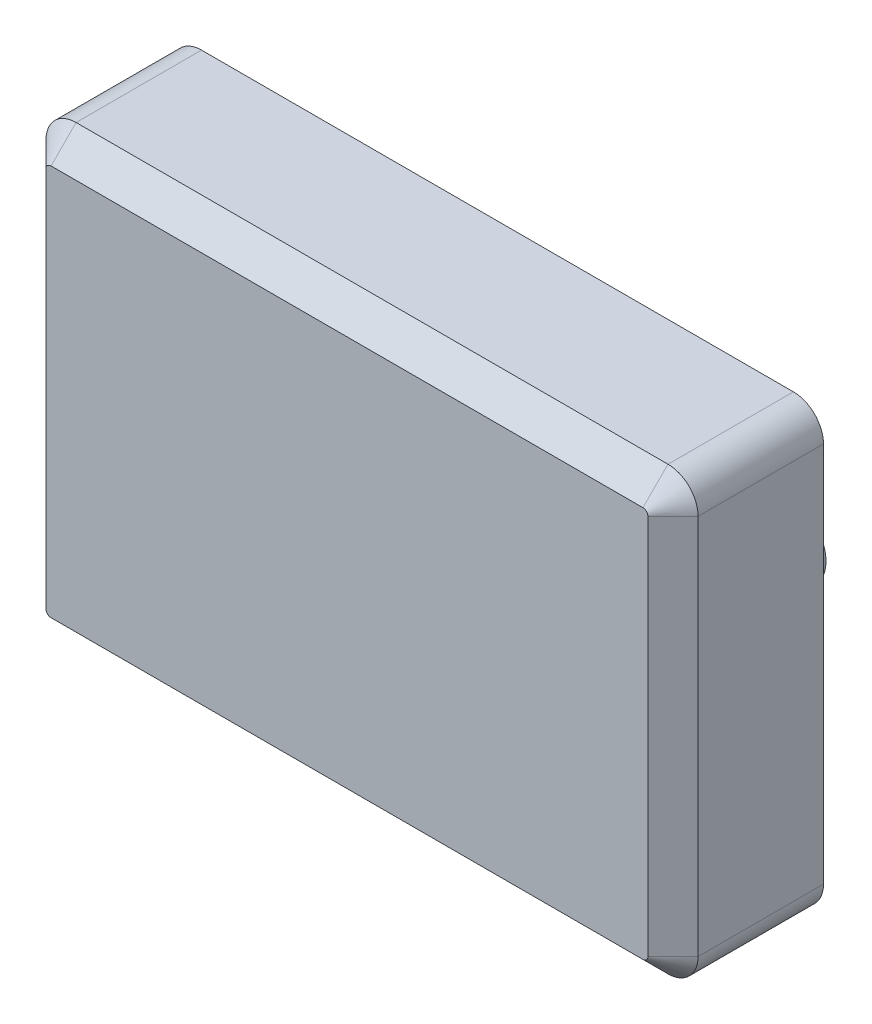
ISO-10303-21;
HEADER;
FILE_DESCRIPTION(('STEP AP214'),'2;1');
FILE_NAME('part.step','',(''),(''),'','','');
FILE_SCHEMA(('AUTOMOTIVE_DESIGN { 1 0 10303 214 1 1 1 1 }'));
ENDSEC;
DATA;
#1=APPLICATION_CONTEXT('core data for automotive mechanical design processes');
#2=APPLICATION_PROTOCOL_DEFINITION('international standard','automotive_design',2000,#1);
#3=PRODUCT_CONTEXT('',#1,'mechanical');
#4=PRODUCT('Part','Part','',(#3));
#5=PRODUCT_RELATED_PRODUCT_CATEGORY('part','',(#4));
#6=PRODUCT_DEFINITION_FORMATION('','',#4);
#7=PRODUCT_DEFINITION_CONTEXT('part definition',#1,'design');
#8=PRODUCT_DEFINITION('design','',#6,#7);
#9=PRODUCT_DEFINITION_SHAPE('','',#8);
#10=(LENGTH_UNIT() NAMED_UNIT(*) SI_UNIT(.MILLI.,.METRE.));
#11=(NAMED_UNIT(*) PLANE_ANGLE_UNIT() SI_UNIT($,.RADIAN.));
#12=(NAMED_UNIT(*) SI_UNIT($,.STERADIAN.) SOLID_ANGLE_UNIT());
#13=UNCERTAINTY_MEASURE_WITH_UNIT(LENGTH_MEASURE(1.E-05),#10,'distance_accuracy_value','');
#14=(GEOMETRIC_REPRESENTATION_CONTEXT(3) GLOBAL_UNCERTAINTY_ASSIGNED_CONTEXT((#13)) GLOBAL_UNIT_ASSIGNED_CONTEXT((#10,
#11,#12)) REPRESENTATION_CONTEXT('',''));
#15=CARTESIAN_POINT('',(0.,0.,0.));
#16=DIRECTION('',(0.,0.,1.));
#17=DIRECTION('',(1.,0.,0.));
#18=AXIS2_PLACEMENT_3D('',#15,#16,#17);
#19=CARTESIAN_POINT('',(-5.9,-3.8,3.));
#20=DIRECTION('',(0.,0.,-1.));
#21=DIRECTION('',(-1.,0.,0.));
#22=AXIS2_PLACEMENT_3D('',#19,#20,#21);
#23=CYLINDRICAL_SURFACE('',#22,0.6);
#24=DIRECTION('',(0.,0.,-1.));
#25=VECTOR('',#24,1.);
#26=CARTESIAN_POINT('',(-5.9,-4.4,3.));
#27=LINE('',#26,#25);
#28=CARTESIAN_POINT('',(-5.9,-4.4,2.5));
#29=VERTEX_POINT('',#28);
#30=CARTESIAN_POINT('',(-5.9,-4.4,0.));
#31=VERTEX_POINT('',#30);
#32=EDGE_CURVE('E130',#29,#31,#27,.T.);
#33=ORIENTED_EDGE('',*,*,#32,.F.);
#34=CARTESIAN_POINT('',(-5.9,-3.8,2.5));
#35=DIRECTION('',(0.,0.,1.));
#36=DIRECTION('',(1.,0.,0.));
#37=AXIS2_PLACEMENT_3D('',#34,#35,#36);
#38=CIRCLE('',#37,0.6);
#39=CARTESIAN_POINT('',(-6.5,-3.8,2.5));
#40=VERTEX_POINT('',#39);
#41=EDGE_CURVE('E216',#29,#40,#38,.F.);
#42=ORIENTED_EDGE('',*,*,#41,.T.);
#43=DIRECTION('',(0.,0.,-1.));
#44=VECTOR('',#43,1.);
#45=CARTESIAN_POINT('',(-6.5,-3.8,3.));
#46=LINE('',#45,#44);
#47=CARTESIAN_POINT('',(-6.5,-3.8,0.));
#48=VERTEX_POINT('',#47);
#49=EDGE_CURVE('E151',#40,#48,#46,.T.);
#50=ORIENTED_EDGE('',*,*,#49,.T.);
#51=CARTESIAN_POINT('',(-5.9,-3.8,0.));
#52=DIRECTION('',(0.,0.,1.));
#53=DIRECTION('',(1.,0.,0.));
#54=AXIS2_PLACEMENT_3D('',#51,#52,#53);
#55=CIRCLE('',#54,0.6);
#56=EDGE_CURVE('E145',#48,#31,#55,.T.);
#57=ORIENTED_EDGE('',*,*,#56,.T.);
#58=EDGE_LOOP('',(#33,#42,#50,#57));
#59=FACE_BOUND('',#58,.T.);
#60=ADVANCED_FACE('F42',(#59),#23,.T.);
#61=CARTESIAN_POINT('',(-5.9,-4.4,3.));
#62=DIRECTION('',(0.,1.,0.));
#63=DIRECTION('',(0.,0.,1.));
#64=AXIS2_PLACEMENT_3D('',#61,#62,#63);
#65=PLANE('',#64);
#66=DIRECTION('',(0.,0.,-1.));
#67=VECTOR('',#66,1.);
#68=CARTESIAN_POINT('',(5.9,-4.4,3.));
#69=LINE('',#68,#67);
#70=CARTESIAN_POINT('',(5.9,-4.4,2.5));
#71=VERTEX_POINT('',#70);
#72=CARTESIAN_POINT('',(5.9,-4.4,0.));
#73=VERTEX_POINT('',#72);
#74=EDGE_CURVE('E139',#71,#73,#69,.T.);
#75=ORIENTED_EDGE('',*,*,#74,.F.);
#76=DIRECTION('',(-1.,0.,0.));
#77=VECTOR('',#76,1.);
#78=CARTESIAN_POINT('',(-5.9,-4.4,2.5));
#79=LINE('',#78,#77);
#80=EDGE_CURVE('E11',#71,#29,#79,.T.);
#81=ORIENTED_EDGE('',*,*,#80,.T.);
#82=ORIENTED_EDGE('',*,*,#32,.T.);
#83=DIRECTION('',(1.,0.,0.));
#84=VECTOR('',#83,1.);
#85=CARTESIAN_POINT('',(-5.9,-4.4,0.));
#86=LINE('',#85,#84);
#87=EDGE_CURVE('E133',#31,#73,#86,.T.);
#88=ORIENTED_EDGE('',*,*,#87,.T.);
#89=EDGE_LOOP('',(#75,#81,#82,#88));
#90=FACE_BOUND('',#89,.T.);
#91=ADVANCED_FACE('F132',(#90),#65,.F.);
#92=CARTESIAN_POINT('',(5.9,-3.8,3.));
#93=DIRECTION('',(0.,0.,-1.));
#94=DIRECTION('',(-1.,0.,0.));
#95=AXIS2_PLACEMENT_3D('',#92,#93,#94);
#96=CYLINDRICAL_SURFACE('',#95,0.6);
#97=DIRECTION('',(0.,0.,-1.));
#98=VECTOR('',#97,1.);
#99=CARTESIAN_POINT('',(6.5,-3.8,3.));
#100=LINE('',#99,#98);
#101=CARTESIAN_POINT('',(6.5,-3.8,2.5));
#102=VERTEX_POINT('',#101);
#103=CARTESIAN_POINT('',(6.5,-3.8,0.));
#104=VERTEX_POINT('',#103);
#105=EDGE_CURVE('E186',#102,#104,#100,.T.);
#106=ORIENTED_EDGE('',*,*,#105,.F.);
#107=CARTESIAN_POINT('',(5.9,-3.8,2.5));
#108=DIRECTION('',(0.,0.,1.));
#109=DIRECTION('',(1.,0.,0.));
#110=AXIS2_PLACEMENT_3D('',#107,#108,#109);
#111=CIRCLE('',#110,0.6);
#112=EDGE_CURVE('E52',#102,#71,#111,.F.);
#113=ORIENTED_EDGE('',*,*,#112,.T.);
#114=ORIENTED_EDGE('',*,*,#74,.T.);
#115=CARTESIAN_POINT('',(5.9,-3.8,0.));
#116=DIRECTION('',(0.,0.,1.));
#117=DIRECTION('',(1.,0.,0.));
#118=AXIS2_PLACEMENT_3D('',#115,#116,#117);
#119=CIRCLE('',#118,0.6);
#120=EDGE_CURVE('E148',#73,#104,#119,.T.);
#121=ORIENTED_EDGE('',*,*,#120,.T.);
#122=EDGE_LOOP('',(#106,#113,#114,#121));
#123=FACE_BOUND('',#122,.T.);
#124=ADVANCED_FACE('F276',(#123),#96,.T.);
#125=CARTESIAN_POINT('',(6.5,-3.8,3.));
#126=DIRECTION('',(-1.,0.,0.));
#127=DIRECTION('',(0.,0.,1.));
#128=AXIS2_PLACEMENT_3D('',#125,#126,#127);
#129=PLANE('',#128);
#130=DIRECTION('',(0.,0.,-1.));
#131=VECTOR('',#130,1.);
#132=CARTESIAN_POINT('',(6.5,3.8,3.));
#133=LINE('',#132,#131);
#134=CARTESIAN_POINT('',(6.5,3.8,2.5));
#135=VERTEX_POINT('',#134);
#136=CARTESIAN_POINT('',(6.5,3.8,0.));
#137=VERTEX_POINT('',#136);
#138=EDGE_CURVE('E184',#135,#137,#133,.T.);
#139=ORIENTED_EDGE('',*,*,#138,.F.);
#140=DIRECTION('',(0.,-1.,0.));
#141=VECTOR('',#140,1.);
#142=CARTESIAN_POINT('',(6.5,-3.8,2.5));
#143=LINE('',#142,#141);
#144=EDGE_CURVE('E214',#135,#102,#143,.T.);
#145=ORIENTED_EDGE('',*,*,#144,.T.);
#146=ORIENTED_EDGE('',*,*,#105,.T.);
#147=DIRECTION('',(0.,1.,0.));
#148=VECTOR('',#147,1.);
#149=CARTESIAN_POINT('',(6.5,-3.8,0.));
#150=LINE('',#149,#148);
#151=EDGE_CURVE('E163',#104,#137,#150,.T.);
#152=ORIENTED_EDGE('',*,*,#151,.T.);
#153=EDGE_LOOP('',(#139,#145,#146,#152));
#154=FACE_BOUND('',#153,.T.);
#155=ADVANCED_FACE('F354',(#154),#129,.F.);
#156=CARTESIAN_POINT('',(5.9,3.8,3.));
#157=DIRECTION('',(0.,0.,-1.));
#158=DIRECTION('',(-1.,0.,0.));
#159=AXIS2_PLACEMENT_3D('',#156,#157,#158);
#160=CYLINDRICAL_SURFACE('',#159,0.6);
#161=DIRECTION('',(0.,0.,-1.));
#162=VECTOR('',#161,1.);
#163=CARTESIAN_POINT('',(5.9,4.4,3.));
#164=LINE('',#163,#162);
#165=CARTESIAN_POINT('',(5.9,4.4,2.5));
#166=VERTEX_POINT('',#165);
#167=CARTESIAN_POINT('',(5.9,4.4,0.));
#168=VERTEX_POINT('',#167);
#169=EDGE_CURVE('E182',#166,#168,#164,.T.);
#170=ORIENTED_EDGE('',*,*,#169,.F.);
#171=CARTESIAN_POINT('',(5.9,3.8,2.5));
#172=DIRECTION('',(0.,0.,1.));
#173=DIRECTION('',(1.,0.,0.));
#174=AXIS2_PLACEMENT_3D('',#171,#172,#173);
#175=CIRCLE('',#174,0.6);
#176=EDGE_CURVE('E210',#166,#135,#175,.F.);
#177=ORIENTED_EDGE('',*,*,#176,.T.);
#178=ORIENTED_EDGE('',*,*,#138,.T.);
#179=CARTESIAN_POINT('',(5.9,3.8,0.));
#180=DIRECTION('',(0.,0.,1.));
#181=DIRECTION('',(1.,0.,0.));
#182=AXIS2_PLACEMENT_3D('',#179,#180,#181);
#183=CIRCLE('',#182,0.6);
#184=EDGE_CURVE('E166',#137,#168,#183,.T.);
#185=ORIENTED_EDGE('',*,*,#184,.T.);
#186=EDGE_LOOP('',(#170,#177,#178,#185));
#187=FACE_BOUND('',#186,.T.);
#188=ADVANCED_FACE('F351',(#187),#160,.T.);
#189=CARTESIAN_POINT('',(5.9,4.4,3.));
#190=DIRECTION('',(0.,-1.,0.));
#191=DIRECTION('',(0.,0.,-1.));
#192=AXIS2_PLACEMENT_3D('',#189,#190,#191);
#193=PLANE('',#192);
#194=DIRECTION('',(0.,0.,-1.));
#195=VECTOR('',#194,1.);
#196=CARTESIAN_POINT('',(-5.9,4.4,3.));
#197=LINE('',#196,#195);
#198=CARTESIAN_POINT('',(-5.9,4.4,2.5));
#199=VERTEX_POINT('',#198);
#200=CARTESIAN_POINT('',(-5.9,4.4,0.));
#201=VERTEX_POINT('',#200);
#202=EDGE_CURVE('E180',#199,#201,#197,.T.);
#203=ORIENTED_EDGE('',*,*,#202,.F.);
#204=DIRECTION('',(1.,0.,0.));
#205=VECTOR('',#204,1.);
#206=CARTESIAN_POINT('',(5.9,4.4,2.5));
#207=LINE('',#206,#205);
#208=EDGE_CURVE('E205',#199,#166,#207,.T.);
#209=ORIENTED_EDGE('',*,*,#208,.T.);
#210=ORIENTED_EDGE('',*,*,#169,.T.);
#211=DIRECTION('',(-1.,0.,0.));
#212=VECTOR('',#211,1.);
#213=CARTESIAN_POINT('',(5.9,4.4,0.));
#214=LINE('',#213,#212);
#215=EDGE_CURVE('E169',#168,#201,#214,.T.);
#216=ORIENTED_EDGE('',*,*,#215,.T.);
#217=EDGE_LOOP('',(#203,#209,#210,#216));
#218=FACE_BOUND('',#217,.T.);
#219=ADVANCED_FACE('F348',(#218),#193,.F.);
#220=CARTESIAN_POINT('',(-5.9,3.8,3.));
#221=DIRECTION('',(0.,0.,-1.));
#222=DIRECTION('',(-1.,0.,0.));
#223=AXIS2_PLACEMENT_3D('',#220,#221,#222);
#224=CYLINDRICAL_SURFACE('',#223,0.6);
#225=DIRECTION('',(0.,0.,-1.));
#226=VECTOR('',#225,1.);
#227=CARTESIAN_POINT('',(-6.5,3.8,3.));
#228=LINE('',#227,#226);
#229=CARTESIAN_POINT('',(-6.5,3.8,2.5));
#230=VERTEX_POINT('',#229);
#231=CARTESIAN_POINT('',(-6.5,3.8,0.));
#232=VERTEX_POINT('',#231);
#233=EDGE_CURVE('E178',#230,#232,#228,.T.);
#234=ORIENTED_EDGE('',*,*,#233,.F.);
#235=CARTESIAN_POINT('',(-5.9,3.8,2.5));
#236=DIRECTION('',(0.,0.,1.));
#237=DIRECTION('',(1.,0.,0.));
#238=AXIS2_PLACEMENT_3D('',#235,#236,#237);
#239=CIRCLE('',#238,0.6);
#240=EDGE_CURVE('E208',#230,#199,#239,.F.);
#241=ORIENTED_EDGE('',*,*,#240,.T.);
#242=ORIENTED_EDGE('',*,*,#202,.T.);
#243=CARTESIAN_POINT('',(-5.9,3.8,0.));
#244=DIRECTION('',(0.,0.,1.));
#245=DIRECTION('',(1.,0.,0.));
#246=AXIS2_PLACEMENT_3D('',#243,#244,#245);
#247=CIRCLE('',#246,0.6);
#248=EDGE_CURVE('E172',#201,#232,#247,.T.);
#249=ORIENTED_EDGE('',*,*,#248,.T.);
#250=EDGE_LOOP('',(#234,#241,#242,#249));
#251=FACE_BOUND('',#250,.T.);
#252=ADVANCED_FACE('F342',(#251),#224,.T.);
#253=CARTESIAN_POINT('',(-6.5,3.8,3.));
#254=DIRECTION('',(1.,0.,0.));
#255=DIRECTION('',(0.,0.,-1.));
#256=AXIS2_PLACEMENT_3D('',#253,#254,#255);
#257=PLANE('',#256);
#258=ORIENTED_EDGE('',*,*,#49,.F.);
#259=DIRECTION('',(0.,1.,0.));
#260=VECTOR('',#259,1.);
#261=CARTESIAN_POINT('',(-6.5,3.8,2.5));
#262=LINE('',#261,#260);
#263=EDGE_CURVE('E212',#40,#230,#262,.T.);
#264=ORIENTED_EDGE('',*,*,#263,.T.);
#265=ORIENTED_EDGE('',*,*,#233,.T.);
#266=DIRECTION('',(0.,-1.,0.));
#267=VECTOR('',#266,1.);
#268=CARTESIAN_POINT('',(-6.5,3.8,0.));
#269=LINE('',#268,#267);
#270=EDGE_CURVE('E175',#232,#48,#269,.T.);
#271=ORIENTED_EDGE('',*,*,#270,.T.);
#272=EDGE_LOOP('',(#258,#264,#265,#271));
#273=FACE_BOUND('',#272,.T.);
#274=ADVANCED_FACE('F336',(#273),#257,.F.);
#275=CARTESIAN_POINT('',(-5.9,-3.8,3.));
#276=DIRECTION('',(0.,0.,1.));
#277=DIRECTION('',(1.,0.,0.));
#278=AXIS2_PLACEMENT_3D('',#275,#276,#277);
#279=PLANE('',#278);
#280=CARTESIAN_POINT('',(5.9,3.8,3.));
#281=DIRECTION('',(0.,0.,1.));
#282=DIRECTION('',(1.,0.,0.));
#283=AXIS2_PLACEMENT_3D('',#280,#281,#282);
#284=CIRCLE('',#283,0.0999999999999994);
#285=CARTESIAN_POINT('',(6.,3.8,3.));
#286=VERTEX_POINT('',#285);
#287=CARTESIAN_POINT('',(5.9,3.9,3.));
#288=VERTEX_POINT('',#287);
#289=EDGE_CURVE('E198',#286,#288,#284,.T.);
#290=ORIENTED_EDGE('',*,*,#289,.T.);
#291=DIRECTION('',(-1.,0.,0.));
#292=VECTOR('',#291,1.);
#293=CARTESIAN_POINT('',(-5.9,3.9,3.));
#294=LINE('',#293,#292);
#295=CARTESIAN_POINT('',(-5.9,3.9,3.));
#296=VERTEX_POINT('',#295);
#297=EDGE_CURVE('E202',#288,#296,#294,.T.);
#298=ORIENTED_EDGE('',*,*,#297,.T.);
#299=CARTESIAN_POINT('',(-5.9,3.8,3.));
#300=DIRECTION('',(0.,0.,1.));
#301=DIRECTION('',(1.,0.,0.));
#302=AXIS2_PLACEMENT_3D('',#299,#300,#301);
#303=CIRCLE('',#302,0.0999999999999994);
#304=CARTESIAN_POINT('',(-6.,3.8,3.));
#305=VERTEX_POINT('',#304);
#306=EDGE_CURVE('E200',#296,#305,#303,.T.);
#307=ORIENTED_EDGE('',*,*,#306,.T.);
#308=DIRECTION('',(0.,-1.,0.));
#309=VECTOR('',#308,1.);
#310=CARTESIAN_POINT('',(-6.,-3.8,3.));
#311=LINE('',#310,#309);
#312=CARTESIAN_POINT('',(-6.,-3.8,3.));
#313=VERTEX_POINT('',#312);
#314=EDGE_CURVE('E196',#305,#313,#311,.T.);
#315=ORIENTED_EDGE('',*,*,#314,.T.);
#316=CARTESIAN_POINT('',(-5.9,-3.8,3.));
#317=DIRECTION('',(0.,0.,1.));
#318=DIRECTION('',(1.,0.,0.));
#319=AXIS2_PLACEMENT_3D('',#316,#317,#318);
#320=CIRCLE('',#319,0.0999999999999994);
#321=CARTESIAN_POINT('',(-5.9,-3.9,3.));
#322=VERTEX_POINT('',#321);
#323=EDGE_CURVE('E192',#313,#322,#320,.T.);
#324=ORIENTED_EDGE('',*,*,#323,.T.);
#325=DIRECTION('',(1.,0.,0.));
#326=VECTOR('',#325,1.);
#327=CARTESIAN_POINT('',(5.9,-3.9,3.));
#328=LINE('',#327,#326);
#329=CARTESIAN_POINT('',(5.9,-3.9,3.));
#330=VERTEX_POINT('',#329);
#331=EDGE_CURVE('E138',#322,#330,#328,.T.);
#332=ORIENTED_EDGE('',*,*,#331,.T.);
#333=CARTESIAN_POINT('',(5.9,-3.8,3.));
#334=DIRECTION('',(0.,0.,1.));
#335=DIRECTION('',(1.,0.,0.));
#336=AXIS2_PLACEMENT_3D('',#333,#334,#335);
#337=CIRCLE('',#336,0.0999999999999994);
#338=CARTESIAN_POINT('',(6.,-3.8,3.));
#339=VERTEX_POINT('',#338);
#340=EDGE_CURVE('E190',#330,#339,#337,.T.);
#341=ORIENTED_EDGE('',*,*,#340,.T.);
#342=DIRECTION('',(0.,1.,0.));
#343=VECTOR('',#342,1.);
#344=CARTESIAN_POINT('',(6.,3.8,3.));
#345=LINE('',#344,#343);
#346=EDGE_CURVE('E194',#339,#286,#345,.T.);
#347=ORIENTED_EDGE('',*,*,#346,.T.);
#348=EDGE_LOOP('',(#290,#298,#307,#315,#324,#332,#341,#347));
#349=FACE_BOUND('',#348,.T.);
#350=ADVANCED_FACE('F370',(#349),#279,.T.);
#351=CARTESIAN_POINT('',(-5.9,-3.8,0.));
#352=DIRECTION('',(0.,0.,1.));
#353=DIRECTION('',(1.,0.,0.));
#354=AXIS2_PLACEMENT_3D('',#351,#352,#353);
#355=PLANE('',#354);
#356=CARTESIAN_POINT('',(-4.,0.,0.));
#357=DIRECTION('',(0.,0.,1.));
#358=DIRECTION('',(1.,0.,0.));
#359=AXIS2_PLACEMENT_3D('',#356,#357,#358);
#360=CIRCLE('',#359,0.75);
#361=CARTESIAN_POINT('',(-3.25,0.,0.));
#362=VERTEX_POINT('',#361);
#363=EDGE_CURVE('E156',#362,#362,#360,.T.);
#364=ORIENTED_EDGE('',*,*,#363,.T.);
#365=EDGE_LOOP('',(#364));
#366=FACE_BOUND('',#365,.T.);
#367=CARTESIAN_POINT('',(4.,0.,0.));
#368=DIRECTION('',(0.,0.,1.));
#369=DIRECTION('',(1.,0.,0.));
#370=AXIS2_PLACEMENT_3D('',#367,#368,#369);
#371=CIRCLE('',#370,0.75);
#372=CARTESIAN_POINT('',(4.75,0.,0.));
#373=VERTEX_POINT('',#372);
#374=EDGE_CURVE('E244',#373,#373,#371,.T.);
#375=ORIENTED_EDGE('',*,*,#374,.T.);
#376=EDGE_LOOP('',(#375));
#377=FACE_BOUND('',#376,.T.);
#378=ORIENTED_EDGE('',*,*,#56,.F.);
#379=ORIENTED_EDGE('',*,*,#270,.F.);
#380=ORIENTED_EDGE('',*,*,#248,.F.);
#381=ORIENTED_EDGE('',*,*,#215,.F.);
#382=ORIENTED_EDGE('',*,*,#184,.F.);
#383=ORIENTED_EDGE('',*,*,#151,.F.);
#384=ORIENTED_EDGE('',*,*,#120,.F.);
#385=ORIENTED_EDGE('',*,*,#87,.F.);
#386=EDGE_LOOP('',(#378,#379,#380,#381,#382,#383,#384,#385));
#387=FACE_BOUND('',#386,.T.);
#388=ADVANCED_FACE('F143',(#366,#377,#387),#355,.F.);
#389=CARTESIAN_POINT('',(4.,0.,-1.8));
#390=DIRECTION('',(0.,0.,1.));
#391=DIRECTION('',(1.,0.,0.));
#392=AXIS2_PLACEMENT_3D('',#389,#390,#391);
#393=CYLINDRICAL_SURFACE('',#392,0.75);
#394=CARTESIAN_POINT('',(4.,0.,-1.8));
#395=DIRECTION('',(0.,0.,1.));
#396=DIRECTION('',(1.,0.,0.));
#397=AXIS2_PLACEMENT_3D('',#394,#395,#396);
#398=CIRCLE('',#397,0.75);
#399=CARTESIAN_POINT('',(4.75,0.,-1.8));
#400=VERTEX_POINT('',#399);
#401=EDGE_CURVE('E159',#400,#400,#398,.T.);
#402=ORIENTED_EDGE('',*,*,#401,.T.);
#403=EDGE_LOOP('',(#402));
#404=FACE_BOUND('',#403,.T.);
#405=ORIENTED_EDGE('',*,*,#374,.F.);
#406=EDGE_LOOP('',(#405));
#407=FACE_BOUND('',#406,.T.);
#408=ADVANCED_FACE('F267',(#404,#407),#393,.T.);
#409=CARTESIAN_POINT('',(4.,0.,-1.8));
#410=DIRECTION('',(0.,0.,1.));
#411=DIRECTION('',(1.,0.,0.));
#412=AXIS2_PLACEMENT_3D('',#409,#410,#411);
#413=PLANE('',#412);
#414=ORIENTED_EDGE('',*,*,#401,.F.);
#415=EDGE_LOOP('',(#414));
#416=FACE_BOUND('',#415,.T.);
#417=ADVANCED_FACE('F258',(#416),#413,.F.);
#418=CARTESIAN_POINT('',(-4.,0.,-1.8));
#419=DIRECTION('',(0.,0.,1.));
#420=DIRECTION('',(1.,0.,0.));
#421=AXIS2_PLACEMENT_3D('',#418,#419,#420);
#422=CYLINDRICAL_SURFACE('',#421,0.75);
#423=CARTESIAN_POINT('',(-4.,0.,-1.8));
#424=DIRECTION('',(0.,0.,1.));
#425=DIRECTION('',(1.,0.,0.));
#426=AXIS2_PLACEMENT_3D('',#423,#424,#425);
#427=CIRCLE('',#426,0.75);
#428=CARTESIAN_POINT('',(-3.25,0.,-1.8));
#429=VERTEX_POINT('',#428);
#430=EDGE_CURVE('E153',#429,#429,#427,.T.);
#431=ORIENTED_EDGE('',*,*,#430,.T.);
#432=EDGE_LOOP('',(#431));
#433=FACE_BOUND('',#432,.T.);
#434=ORIENTED_EDGE('',*,*,#363,.F.);
#435=EDGE_LOOP('',(#434));
#436=FACE_BOUND('',#435,.T.);
#437=ADVANCED_FACE('F255',(#433,#436),#422,.T.);
#438=CARTESIAN_POINT('',(-4.,0.,-1.8));
#439=DIRECTION('',(0.,0.,1.));
#440=DIRECTION('',(1.,0.,0.));
#441=AXIS2_PLACEMENT_3D('',#438,#439,#440);
#442=PLANE('',#441);
#443=ORIENTED_EDGE('',*,*,#430,.F.);
#444=EDGE_LOOP('',(#443));
#445=FACE_BOUND('',#444,.T.);
#446=ADVANCED_FACE('F257',(#445),#442,.F.);
#447=CARTESIAN_POINT('',(-5.9,-3.9,3.));
#448=DIRECTION('',(0.,-0.707106781186549,0.707106781186546));
#449=DIRECTION('',(-1.,0.,0.));
#450=AXIS2_PLACEMENT_3D('',#447,#448,#449);
#451=PLANE('',#450);
#452=DIRECTION('',(0.,0.707106781186546,0.707106781186549));
#453=VECTOR('',#452,1.);
#454=CARTESIAN_POINT('',(-5.9,-4.4,2.5));
#455=LINE('',#454,#453);
#456=EDGE_CURVE('E234',#29,#322,#455,.T.);
#457=ORIENTED_EDGE('',*,*,#456,.F.);
#458=ORIENTED_EDGE('',*,*,#80,.F.);
#459=DIRECTION('',(0.,-0.707106781186546,-0.707106781186549));
#460=VECTOR('',#459,1.);
#461=CARTESIAN_POINT('',(5.9,-3.9,3.));
#462=LINE('',#461,#460);
#463=EDGE_CURVE('E47',#330,#71,#462,.T.);
#464=ORIENTED_EDGE('',*,*,#463,.F.);
#465=ORIENTED_EDGE('',*,*,#331,.F.);
#466=EDGE_LOOP('',(#457,#458,#464,#465));
#467=FACE_BOUND('',#466,.T.);
#468=ADVANCED_FACE('F45',(#467),#451,.T.);
#469=CARTESIAN_POINT('',(5.9,-3.8,3.));
#470=DIRECTION('',(0.,0.,-1.));
#471=DIRECTION('',(-1.,0.,0.));
#472=AXIS2_PLACEMENT_3D('',#469,#470,#471);
#473=CONICAL_SURFACE('',#472,0.0999999999999994,0.785398163397447);
#474=ORIENTED_EDGE('',*,*,#463,.T.);
#475=ORIENTED_EDGE('',*,*,#112,.F.);
#476=DIRECTION('',(0.707106781186546,0.,-0.707106781186549));
#477=VECTOR('',#476,1.);
#478=CARTESIAN_POINT('',(6.,-3.8,3.));
#479=LINE('',#478,#477);
#480=EDGE_CURVE('E232',#339,#102,#479,.T.);
#481=ORIENTED_EDGE('',*,*,#480,.F.);
#482=ORIENTED_EDGE('',*,*,#340,.F.);
#483=EDGE_LOOP('',(#474,#475,#481,#482));
#484=FACE_BOUND('',#483,.T.);
#485=ADVANCED_FACE('F321',(#484),#473,.T.);
#486=CARTESIAN_POINT('',(-5.9,-3.8,3.));
#487=DIRECTION('',(0.,0.,-1.));
#488=DIRECTION('',(-1.,0.,0.));
#489=AXIS2_PLACEMENT_3D('',#486,#487,#488);
#490=CONICAL_SURFACE('',#489,0.0999999999999994,0.785398163397447);
#491=ORIENTED_EDGE('',*,*,#456,.T.);
#492=ORIENTED_EDGE('',*,*,#323,.F.);
#493=DIRECTION('',(0.707106781186546,0.,0.707106781186549));
#494=VECTOR('',#493,1.);
#495=CARTESIAN_POINT('',(-6.5,-3.8,2.5));
#496=LINE('',#495,#494);
#497=EDGE_CURVE('E229',#40,#313,#496,.T.);
#498=ORIENTED_EDGE('',*,*,#497,.F.);
#499=ORIENTED_EDGE('',*,*,#41,.F.);
#500=EDGE_LOOP('',(#491,#492,#498,#499));
#501=FACE_BOUND('',#500,.T.);
#502=ADVANCED_FACE('F315',(#501),#490,.T.);
#503=CARTESIAN_POINT('',(6.,-3.8,3.));
#504=DIRECTION('',(0.707106781186549,0.,0.707106781186546));
#505=DIRECTION('',(0.,-1.,0.));
#506=AXIS2_PLACEMENT_3D('',#503,#504,#505);
#507=PLANE('',#506);
#508=ORIENTED_EDGE('',*,*,#480,.T.);
#509=ORIENTED_EDGE('',*,*,#144,.F.);
#510=DIRECTION('',(0.707106781186546,0.,-0.707106781186549));
#511=VECTOR('',#510,1.);
#512=CARTESIAN_POINT('',(6.,3.8,3.));
#513=LINE('',#512,#511);
#514=EDGE_CURVE('E226',#286,#135,#513,.T.);
#515=ORIENTED_EDGE('',*,*,#514,.F.);
#516=ORIENTED_EDGE('',*,*,#346,.F.);
#517=EDGE_LOOP('',(#508,#509,#515,#516));
#518=FACE_BOUND('',#517,.T.);
#519=ADVANCED_FACE('F308',(#518),#507,.T.);
#520=CARTESIAN_POINT('',(-6.,-3.8,3.));
#521=DIRECTION('',(-0.707106781186549,0.,0.707106781186546));
#522=DIRECTION('',(0.,1.,0.));
#523=AXIS2_PLACEMENT_3D('',#520,#521,#522);
#524=PLANE('',#523);
#525=ORIENTED_EDGE('',*,*,#497,.T.);
#526=ORIENTED_EDGE('',*,*,#314,.F.);
#527=DIRECTION('',(0.707106781186546,0.,0.707106781186549));
#528=VECTOR('',#527,1.);
#529=CARTESIAN_POINT('',(-6.5,3.8,2.5));
#530=LINE('',#529,#528);
#531=EDGE_CURVE('E223',#230,#305,#530,.T.);
#532=ORIENTED_EDGE('',*,*,#531,.F.);
#533=ORIENTED_EDGE('',*,*,#263,.F.);
#534=EDGE_LOOP('',(#525,#526,#532,#533));
#535=FACE_BOUND('',#534,.T.);
#536=ADVANCED_FACE('F301',(#535),#524,.T.);
#537=CARTESIAN_POINT('',(5.9,3.8,3.));
#538=DIRECTION('',(0.,0.,-1.));
#539=DIRECTION('',(-1.,0.,0.));
#540=AXIS2_PLACEMENT_3D('',#537,#538,#539);
#541=CONICAL_SURFACE('',#540,0.0999999999999994,0.785398163397447);
#542=ORIENTED_EDGE('',*,*,#514,.T.);
#543=ORIENTED_EDGE('',*,*,#176,.F.);
#544=DIRECTION('',(0.,0.707106781186546,-0.707106781186549));
#545=VECTOR('',#544,1.);
#546=CARTESIAN_POINT('',(5.9,3.9,3.));
#547=LINE('',#546,#545);
#548=EDGE_CURVE('E221',#288,#166,#547,.T.);
#549=ORIENTED_EDGE('',*,*,#548,.F.);
#550=ORIENTED_EDGE('',*,*,#289,.F.);
#551=EDGE_LOOP('',(#542,#543,#549,#550));
#552=FACE_BOUND('',#551,.T.);
#553=ADVANCED_FACE('F294',(#552),#541,.T.);
#554=CARTESIAN_POINT('',(-5.9,3.8,3.));
#555=DIRECTION('',(0.,0.,-1.));
#556=DIRECTION('',(-1.,0.,0.));
#557=AXIS2_PLACEMENT_3D('',#554,#555,#556);
#558=CONICAL_SURFACE('',#557,0.0999999999999994,0.785398163397447);
#559=ORIENTED_EDGE('',*,*,#531,.T.);
#560=ORIENTED_EDGE('',*,*,#306,.F.);
#561=DIRECTION('',(0.,-0.707106781186546,0.707106781186549));
#562=VECTOR('',#561,1.);
#563=CARTESIAN_POINT('',(-5.9,4.4,2.5));
#564=LINE('',#563,#562);
#565=EDGE_CURVE('E219',#199,#296,#564,.T.);
#566=ORIENTED_EDGE('',*,*,#565,.F.);
#567=ORIENTED_EDGE('',*,*,#240,.F.);
#568=EDGE_LOOP('',(#559,#560,#566,#567));
#569=FACE_BOUND('',#568,.T.);
#570=ADVANCED_FACE('F287',(#569),#558,.T.);
#571=CARTESIAN_POINT('',(-5.9,3.9,3.));
#572=DIRECTION('',(0.,0.707106781186549,0.707106781186546));
#573=DIRECTION('',(1.,0.,0.));
#574=AXIS2_PLACEMENT_3D('',#571,#572,#573);
#575=PLANE('',#574);
#576=ORIENTED_EDGE('',*,*,#548,.T.);
#577=ORIENTED_EDGE('',*,*,#208,.F.);
#578=ORIENTED_EDGE('',*,*,#565,.T.);
#579=ORIENTED_EDGE('',*,*,#297,.F.);
#580=EDGE_LOOP('',(#576,#577,#578,#579));
#581=FACE_BOUND('',#580,.T.);
#582=ADVANCED_FACE('F281',(#581),#575,.T.);
#583=CLOSED_SHELL('',(#60,#91,#124,#155,#188,#219,#252,#274,#350,#388,#408,#417,#437,#446,#468,
#485,#502,#519,#536,#553,#570,#582));
#584=MANIFOLD_SOLID_BREP('B2',#583);
#585=ADVANCED_BREP_SHAPE_REPRESENTATION('',(#18,#584),#14);
#586=SHAPE_DEFINITION_REPRESENTATION(#9,#585);
ENDSEC;
END-ISO-10303-21;
